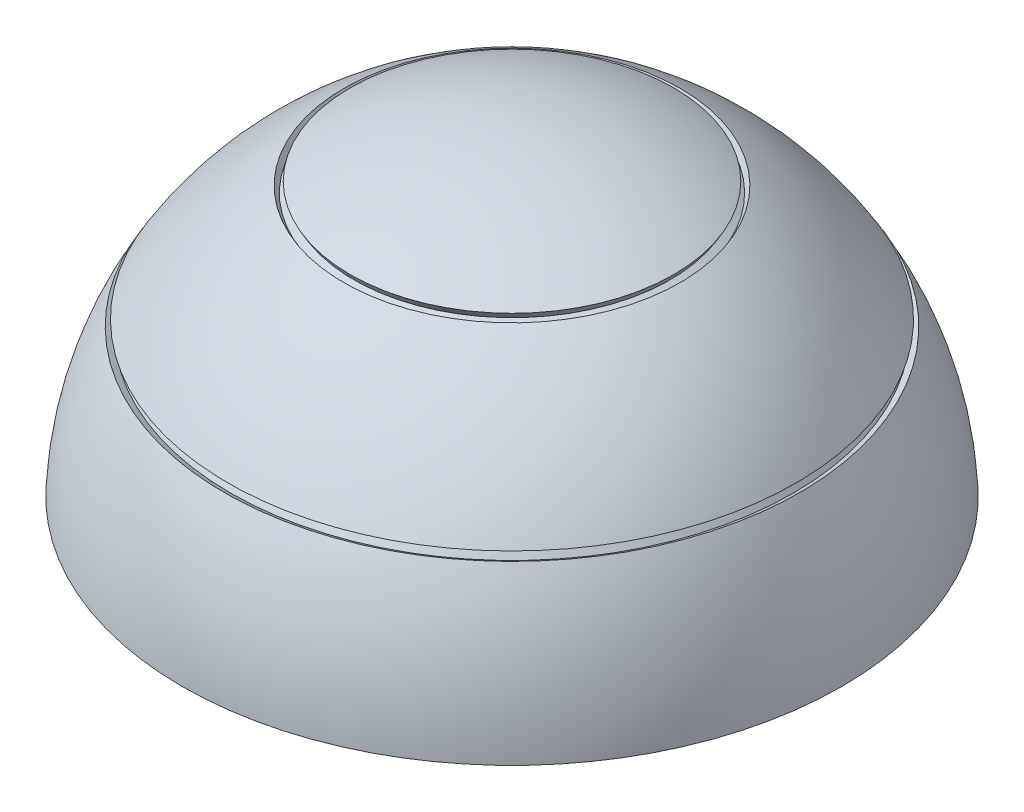
ISO-10303-21;
HEADER;
FILE_DESCRIPTION(('STEP AP214'),'2;1');
FILE_NAME('part.step','',(''),(''),'','','');
FILE_SCHEMA(('AUTOMOTIVE_DESIGN { 1 0 10303 214 1 1 1 1 }'));
ENDSEC;
DATA;
#1=APPLICATION_CONTEXT('core data for automotive mechanical design processes');
#2=APPLICATION_PROTOCOL_DEFINITION('international standard','automotive_design',2000,#1);
#3=PRODUCT_CONTEXT('',#1,'mechanical');
#4=PRODUCT('Part','Part','',(#3));
#5=PRODUCT_RELATED_PRODUCT_CATEGORY('part','',(#4));
#6=PRODUCT_DEFINITION_FORMATION('','',#4);
#7=PRODUCT_DEFINITION_CONTEXT('part definition',#1,'design');
#8=PRODUCT_DEFINITION('design','',#6,#7);
#9=PRODUCT_DEFINITION_SHAPE('','',#8);
#10=(LENGTH_UNIT() NAMED_UNIT(*) SI_UNIT(.MILLI.,.METRE.));
#11=(NAMED_UNIT(*) PLANE_ANGLE_UNIT() SI_UNIT($,.RADIAN.));
#12=(NAMED_UNIT(*) SI_UNIT($,.STERADIAN.) SOLID_ANGLE_UNIT());
#13=UNCERTAINTY_MEASURE_WITH_UNIT(LENGTH_MEASURE(1.E-05),#10,'distance_accuracy_value','');
#14=(GEOMETRIC_REPRESENTATION_CONTEXT(3) GLOBAL_UNCERTAINTY_ASSIGNED_CONTEXT((#13)) GLOBAL_UNIT_ASSIGNED_CONTEXT((#10,
#11,#12)) REPRESENTATION_CONTEXT('',''));
#15=CARTESIAN_POINT('',(0.,0.,0.));
#16=DIRECTION('',(0.,0.,1.));
#17=DIRECTION('',(1.,0.,0.));
#18=AXIS2_PLACEMENT_3D('',#15,#16,#17);
#19=CARTESIAN_POINT('',(0.,0.,0.));
#20=DIRECTION('',(0.,0.,1.));
#21=DIRECTION('',(-1.,0.,0.));
#22=AXIS2_PLACEMENT_3D('',#19,#20,#21);
#23=SPHERICAL_SURFACE('',#22,44.45);
#24=CARTESIAN_POINT('',(0.,0.,0.));
#25=DIRECTION('',(0.,-1.,0.));
#26=DIRECTION('',(0.,0.,-1.));
#27=AXIS2_PLACEMENT_3D('',#24,#25,#26);
#28=SPHERICAL_SURFACE('',#27,44.45);
#29=CARTESIAN_POINT('',(0.,21.7905811793861,0.));
#30=DIRECTION('',(0.,-1.,0.));
#31=DIRECTION('',(0.,0.,-1.));
#32=AXIS2_PLACEMENT_3D('',#29,#30,#31);
#33=CIRCLE('',#32,38.7423937291513);
#34=CARTESIAN_POINT('',(0.,21.7905811793863,-38.7423937291512));
#35=VERTEX_POINT('',#34);
#36=EDGE_CURVE('E59',#35,#35,#33,.T.);
#37=ORIENTED_EDGE('',*,*,#36,.T.);
#38=EDGE_LOOP('',(#37));
#39=FACE_BOUND('',#38,.T.);
#40=CARTESIAN_POINT('',(0.,2.,0.));
#41=DIRECTION('',(0.,1.,0.));
#42=DIRECTION('',(0.,0.,1.));
#43=AXIS2_PLACEMENT_3D('',#40,#41,#42);
#44=CIRCLE('',#43,44.404982828507);
#45=CARTESIAN_POINT('',(0.,2.,44.404982828507));
#46=VERTEX_POINT('',#45);
#47=EDGE_CURVE('E43',#46,#46,#44,.T.);
#48=ORIENTED_EDGE('',*,*,#47,.T.);
#49=EDGE_LOOP('',(#48));
#50=FACE_BOUND('',#49,.T.);
#51=ADVANCED_FACE('F36',(#39,#50),#28,.T.);
#52=CARTESIAN_POINT('',(0.,2.,0.));
#53=DIRECTION('',(0.,1.,0.));
#54=DIRECTION('',(0.,0.,1.));
#55=AXIS2_PLACEMENT_3D('',#52,#53,#54);
#56=PLANE('',#55);
#57=CARTESIAN_POINT('',(0.,2.,0.));
#58=DIRECTION('',(0.,1.,0.));
#59=DIRECTION('',(0.,0.,1.));
#60=AXIS2_PLACEMENT_3D('',#57,#58,#59);
#61=CIRCLE('',#60,42.4028595733825);
#62=CARTESIAN_POINT('',(0.,2.,42.4028595733825));
#63=VERTEX_POINT('',#62);
#64=EDGE_CURVE('E10',#63,#63,#61,.T.);
#65=ORIENTED_EDGE('',*,*,#64,.T.);
#66=EDGE_LOOP('',(#65));
#67=FACE_BOUND('',#66,.T.);
#68=ORIENTED_EDGE('',*,*,#47,.F.);
#69=EDGE_LOOP('',(#68));
#70=FACE_BOUND('',#69,.T.);
#71=ADVANCED_FACE('F82',(#67,#70),#56,.F.);
#72=CARTESIAN_POINT('',(0.,0.,0.));
#73=DIRECTION('',(0.,0.,1.));
#74=DIRECTION('',(-1.,0.,0.));
#75=AXIS2_PLACEMENT_3D('',#72,#73,#74);
#76=SPHERICAL_SURFACE('',#75,42.45);
#77=CARTESIAN_POINT('',(0.,0.,0.));
#78=DIRECTION('',(0.,1.,0.));
#79=DIRECTION('',(0.,0.,1.));
#80=AXIS2_PLACEMENT_3D('',#77,#78,#79);
#81=SPHERICAL_SURFACE('',#80,42.45);
#82=ORIENTED_EDGE('',*,*,#64,.F.);
#83=EDGE_LOOP('',(#82));
#84=FACE_BOUND('',#83,.T.);
#85=ADVANCED_FACE('F72',(#84),#81,.F.);
#86=CARTESIAN_POINT('',(0.,22.658012701892,0.));
#87=DIRECTION('',(0.,1.,0.));
#88=DIRECTION('',(0.,0.,1.));
#89=AXIS2_PLACEMENT_3D('',#86,#87,#88);
#90=CONICAL_SURFACE('',#89,38.2448291982183,1.04719755119665);
#91=CARTESIAN_POINT('',(0.,22.1580127018921,0.));
#92=DIRECTION('',(0.,-1.,0.));
#93=DIRECTION('',(0.,0.,-1.));
#94=AXIS2_PLACEMENT_3D('',#91,#92,#93);
#95=CIRCLE('',#94,37.3788037944339);
#96=CARTESIAN_POINT('',(0.,22.1580127018922,-37.3788037944338));
#97=VERTEX_POINT('',#96);
#98=EDGE_CURVE('E57',#97,#97,#95,.T.);
#99=ORIENTED_EDGE('',*,*,#98,.F.);
#100=EDGE_LOOP('',(#99));
#101=FACE_BOUND('',#100,.T.);
#102=CARTESIAN_POINT('',(0.,22.6566065831706,0.));
#103=DIRECTION('',(0.,-1.,0.));
#104=DIRECTION('',(0.,0.,-1.));
#105=AXIS2_PLACEMENT_3D('',#102,#103,#104);
#106=CIRCLE('',#105,38.2423937291513);
#107=CARTESIAN_POINT('',(0.,22.6566065831707,-38.2423937291512));
#108=VERTEX_POINT('',#107);
#109=EDGE_CURVE('E39',#108,#108,#106,.F.);
#110=ORIENTED_EDGE('',*,*,#109,.F.);
#111=EDGE_LOOP('',(#110));
#112=FACE_BOUND('',#111,.T.);
#113=ADVANCED_FACE('F69',(#101,#112),#90,.T.);
#114=CARTESIAN_POINT('',(0.,21.2919872981077,0.));
#115=DIRECTION('',(0.,1.,0.));
#116=DIRECTION('',(0.,0.,1.));
#117=AXIS2_PLACEMENT_3D('',#114,#115,#116);
#118=CONICAL_SURFACE('',#117,37.8788037944339,1.04719755119665);
#119=CARTESIAN_POINT('',(0.,21.2919872981077,0.));
#120=DIRECTION('',(0.,-1.,0.));
#121=DIRECTION('',(0.,0.,-1.));
#122=AXIS2_PLACEMENT_3D('',#119,#120,#121);
#123=CIRCLE('',#122,37.8788037944339);
#124=CARTESIAN_POINT('',(0.,21.2919872981078,-37.8788037944338));
#125=VERTEX_POINT('',#124);
#126=EDGE_CURVE('E117',#125,#125,#123,.T.);
#127=ORIENTED_EDGE('',*,*,#126,.T.);
#128=EDGE_LOOP('',(#127));
#129=FACE_BOUND('',#128,.T.);
#130=ORIENTED_EDGE('',*,*,#36,.F.);
#131=EDGE_LOOP('',(#130));
#132=FACE_BOUND('',#131,.T.);
#133=ADVANCED_FACE('F71',(#129,#132),#118,.F.);
#134=CARTESIAN_POINT('',(0.,22.1580127018921,0.));
#135=DIRECTION('',(0.,-1.,0.));
#136=DIRECTION('',(0.,0.,-1.));
#137=AXIS2_PLACEMENT_3D('',#134,#135,#136);
#138=CONICAL_SURFACE('',#137,37.3788037944339,0.523598775598297);
#139=ORIENTED_EDGE('',*,*,#126,.F.);
#140=EDGE_LOOP('',(#139));
#141=FACE_BOUND('',#140,.T.);
#142=ORIENTED_EDGE('',*,*,#98,.T.);
#143=EDGE_LOOP('',(#142));
#144=FACE_BOUND('',#143,.T.);
#145=ADVANCED_FACE('F79',(#141,#144),#138,.T.);
#146=CARTESIAN_POINT('',(0.,0.,0.));
#147=DIRECTION('',(0.,-1.,0.));
#148=DIRECTION('',(0.,0.,-1.));
#149=AXIS2_PLACEMENT_3D('',#146,#147,#148);
#150=SPHERICAL_SURFACE('',#149,44.45);
#151=ORIENTED_EDGE('',*,*,#109,.T.);
#152=EDGE_LOOP('',(#151));
#153=FACE_BOUND('',#152,.T.);
#154=CARTESIAN_POINT('',(0.,38.2423937291512,1.33522604058023E-13));
#155=DIRECTION('',(0.,-1.,0.));
#156=DIRECTION('',(0.,0.,-1.));
#157=AXIS2_PLACEMENT_3D('',#154,#155,#156);
#158=CIRCLE('',#157,22.6566065831708);
#159=CARTESIAN_POINT('',(0.,38.2423937291513,-22.6566065831706));
#160=VERTEX_POINT('',#159);
#161=EDGE_CURVE('E53',#160,#160,#158,.T.);
#162=ORIENTED_EDGE('',*,*,#161,.T.);
#163=EDGE_LOOP('',(#162));
#164=FACE_BOUND('',#163,.T.);
#165=ADVANCED_FACE('F66',(#153,#164),#150,.T.);
#166=CARTESIAN_POINT('',(0.,38.7448291982184,1.35276848122243E-13));
#167=DIRECTION('',(0.,1.,0.));
#168=DIRECTION('',(0.,0.,1.));
#169=AXIS2_PLACEMENT_3D('',#166,#167,#168);
#170=CONICAL_SURFACE('',#169,21.7919872981078,0.5235987755983);
#171=CARTESIAN_POINT('',(0.,37.878803794434,1.32253136585966E-13));
#172=DIRECTION('',(0.,-1.,0.));
#173=DIRECTION('',(0.,0.,-1.));
#174=AXIS2_PLACEMENT_3D('',#171,#172,#173);
#175=CIRCLE('',#174,21.2919872981078);
#176=CARTESIAN_POINT('',(0.,37.8788037944341,-21.2919872981077));
#177=VERTEX_POINT('',#176);
#178=EDGE_CURVE('E50',#177,#177,#175,.T.);
#179=ORIENTED_EDGE('',*,*,#178,.F.);
#180=EDGE_LOOP('',(#179));
#181=FACE_BOUND('',#180,.T.);
#182=CARTESIAN_POINT('',(0.,38.7423937291512,1.35268344727445E-13));
#183=DIRECTION('',(0.,-1.,0.));
#184=DIRECTION('',(0.,0.,-1.));
#185=AXIS2_PLACEMENT_3D('',#182,#183,#184);
#186=CIRCLE('',#185,21.7905811793863);
#187=CARTESIAN_POINT('',(0.,38.7423937291513,-21.7905811793861));
#188=VERTEX_POINT('',#187);
#189=EDGE_CURVE('E56',#188,#188,#186,.F.);
#190=ORIENTED_EDGE('',*,*,#189,.F.);
#191=EDGE_LOOP('',(#190));
#192=FACE_BOUND('',#191,.T.);
#193=ADVANCED_FACE('F95',(#181,#192),#170,.T.);
#194=CARTESIAN_POINT('',(0.,37.3788037944338,1.30507395916544E-13));
#195=DIRECTION('',(0.,1.,0.));
#196=DIRECTION('',(0.,0.,1.));
#197=AXIS2_PLACEMENT_3D('',#194,#195,#196);
#198=CONICAL_SURFACE('',#197,22.1580127018923,0.523598775598291);
#199=CARTESIAN_POINT('',(0.,37.3788037944338,1.30507395916544E-13));
#200=DIRECTION('',(0.,-1.,0.));
#201=DIRECTION('',(0.,0.,-1.));
#202=AXIS2_PLACEMENT_3D('',#199,#200,#201);
#203=CIRCLE('',#202,22.1580127018923);
#204=CARTESIAN_POINT('',(0.,37.3788037944339,-22.1580127018921));
#205=VERTEX_POINT('',#204);
#206=EDGE_CURVE('E118',#205,#205,#203,.T.);
#207=ORIENTED_EDGE('',*,*,#206,.T.);
#208=EDGE_LOOP('',(#207));
#209=FACE_BOUND('',#208,.T.);
#210=ORIENTED_EDGE('',*,*,#161,.F.);
#211=EDGE_LOOP('',(#210));
#212=FACE_BOUND('',#211,.T.);
#213=ADVANCED_FACE('F102',(#209,#212),#198,.F.);
#214=CARTESIAN_POINT('',(0.,37.878803794434,1.32253136585966E-13));
#215=DIRECTION('',(0.,-1.,0.));
#216=DIRECTION('',(0.,0.,-1.));
#217=AXIS2_PLACEMENT_3D('',#214,#215,#216);
#218=CONICAL_SURFACE('',#217,21.2919872981078,1.04719755119646);
#219=ORIENTED_EDGE('',*,*,#206,.F.);
#220=EDGE_LOOP('',(#219));
#221=FACE_BOUND('',#220,.T.);
#222=ORIENTED_EDGE('',*,*,#178,.T.);
#223=EDGE_LOOP('',(#222));
#224=FACE_BOUND('',#223,.T.);
#225=ADVANCED_FACE('F97',(#221,#224),#218,.T.);
#226=CARTESIAN_POINT('',(0.,0.,0.));
#227=DIRECTION('',(0.,-1.,0.));
#228=DIRECTION('',(0.,0.,-1.));
#229=AXIS2_PLACEMENT_3D('',#226,#227,#228);
#230=SPHERICAL_SURFACE('',#229,44.45);
#231=ORIENTED_EDGE('',*,*,#189,.T.);
#232=EDGE_LOOP('',(#231));
#233=FACE_BOUND('',#232,.T.);
#234=ADVANCED_FACE('F88',(#233),#230,.T.);
#235=CLOSED_SHELL('',(#51,#71,#85,#113,#133,#145,#165,#193,#213,#225,#234));
#236=MANIFOLD_SOLID_BREP('B2',#235);
#237=ADVANCED_BREP_SHAPE_REPRESENTATION('',(#18,#236),#14);
#238=SHAPE_DEFINITION_REPRESENTATION(#9,#237);
ENDSEC;
END-ISO-10303-21;
